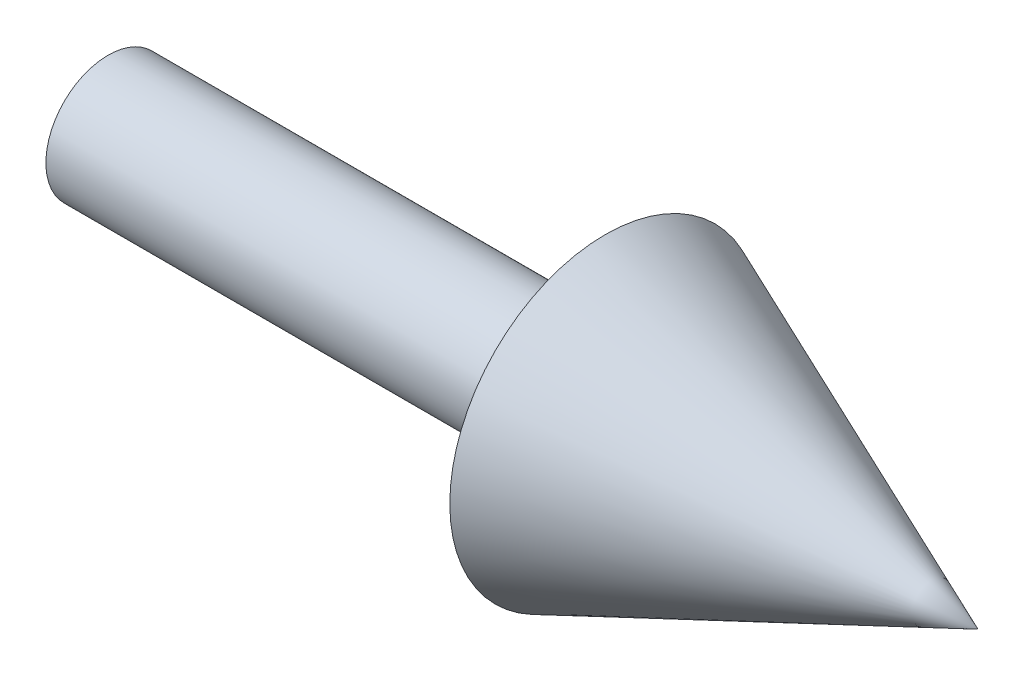
ISO-10303-21;
HEADER;
FILE_DESCRIPTION(('STEP AP214'),'2;1');
FILE_NAME('part.step','',(''),(''),'','','');
FILE_SCHEMA(('AUTOMOTIVE_DESIGN { 1 0 10303 214 1 1 1 1 }'));
ENDSEC;
DATA;
#1=APPLICATION_CONTEXT('core data for automotive mechanical design processes');
#2=APPLICATION_PROTOCOL_DEFINITION('international standard','automotive_design',2000,#1);
#3=PRODUCT_CONTEXT('',#1,'mechanical');
#4=PRODUCT('Part','Part','',(#3));
#5=PRODUCT_RELATED_PRODUCT_CATEGORY('part','',(#4));
#6=PRODUCT_DEFINITION_FORMATION('','',#4);
#7=PRODUCT_DEFINITION_CONTEXT('part definition',#1,'design');
#8=PRODUCT_DEFINITION('design','',#6,#7);
#9=PRODUCT_DEFINITION_SHAPE('','',#8);
#10=(LENGTH_UNIT() NAMED_UNIT(*) SI_UNIT(.MILLI.,.METRE.));
#11=(NAMED_UNIT(*) PLANE_ANGLE_UNIT() SI_UNIT($,.RADIAN.));
#12=(NAMED_UNIT(*) SI_UNIT($,.STERADIAN.) SOLID_ANGLE_UNIT());
#13=UNCERTAINTY_MEASURE_WITH_UNIT(LENGTH_MEASURE(1.E-05),#10,'distance_accuracy_value','');
#14=(GEOMETRIC_REPRESENTATION_CONTEXT(3) GLOBAL_UNCERTAINTY_ASSIGNED_CONTEXT((#13)) GLOBAL_UNIT_ASSIGNED_CONTEXT((#10,
#11,#12)) REPRESENTATION_CONTEXT('',''));
#15=CARTESIAN_POINT('',(0.,0.,0.));
#16=DIRECTION('',(0.,0.,1.));
#17=DIRECTION('',(1.,0.,0.));
#18=AXIS2_PLACEMENT_3D('',#15,#16,#17);
#19=CARTESIAN_POINT('',(0.,0.,0.));
#20=DIRECTION('',(-1.,0.,0.));
#21=DIRECTION('',(0.,0.,1.));
#22=AXIS2_PLACEMENT_3D('',#19,#20,#21);
#23=PLANE('',#22);
#24=CARTESIAN_POINT('',(0.,0.,0.));
#25=DIRECTION('',(1.,0.,0.));
#26=DIRECTION('',(0.,0.,-1.));
#27=AXIS2_PLACEMENT_3D('',#24,#25,#26);
#28=CIRCLE('',#27,5.);
#29=CARTESIAN_POINT('',(0.,0.,-5.));
#30=VERTEX_POINT('',#29);
#31=EDGE_CURVE('E11',#30,#30,#28,.T.);
#32=ORIENTED_EDGE('',*,*,#31,.F.);
#33=EDGE_LOOP('',(#32));
#34=FACE_BOUND('',#33,.T.);
#35=ADVANCED_FACE('F36',(#34),#23,.T.);
#36=CARTESIAN_POINT('',(0.,0.,0.));
#37=DIRECTION('',(1.,0.,0.));
#38=DIRECTION('',(0.,0.,-1.));
#39=AXIS2_PLACEMENT_3D('',#36,#37,#38);
#40=CYLINDRICAL_SURFACE('',#39,5.);
#41=ORIENTED_EDGE('',*,*,#31,.T.);
#42=EDGE_LOOP('',(#41));
#43=FACE_BOUND('',#42,.T.);
#44=CARTESIAN_POINT('',(40.,0.,0.));
#45=DIRECTION('',(1.,0.,0.));
#46=DIRECTION('',(0.,0.,-1.));
#47=AXIS2_PLACEMENT_3D('',#44,#45,#46);
#48=CIRCLE('',#47,5.);
#49=CARTESIAN_POINT('',(40.,0.,-5.));
#50=VERTEX_POINT('',#49);
#51=EDGE_CURVE('E42',#50,#50,#48,.T.);
#52=ORIENTED_EDGE('',*,*,#51,.F.);
#53=EDGE_LOOP('',(#52));
#54=FACE_BOUND('',#53,.T.);
#55=ADVANCED_FACE('F53',(#43,#54),#40,.T.);
#56=CARTESIAN_POINT('',(40.,5.,0.));
#57=DIRECTION('',(-1.,0.,0.));
#58=DIRECTION('',(0.,0.,1.));
#59=AXIS2_PLACEMENT_3D('',#56,#57,#58);
#60=PLANE('',#59);
#61=ORIENTED_EDGE('',*,*,#51,.T.);
#62=EDGE_LOOP('',(#61));
#63=FACE_BOUND('',#62,.T.);
#64=CARTESIAN_POINT('',(40.,0.,0.));
#65=DIRECTION('',(1.,0.,0.));
#66=DIRECTION('',(0.,0.,-1.));
#67=AXIS2_PLACEMENT_3D('',#64,#65,#66);
#68=CIRCLE('',#67,12.5);
#69=CARTESIAN_POINT('',(40.,0.,-12.5));
#70=VERTEX_POINT('',#69);
#71=EDGE_CURVE('E67',#70,#70,#68,.T.);
#72=ORIENTED_EDGE('',*,*,#71,.F.);
#73=EDGE_LOOP('',(#72));
#74=FACE_BOUND('',#73,.T.);
#75=ADVANCED_FACE('F47',(#63,#74),#60,.T.);
#76=CARTESIAN_POINT('',(70.,0.,0.));
#77=DIRECTION('',(-1.,0.,0.));
#78=DIRECTION('',(0.,0.,1.));
#79=AXIS2_PLACEMENT_3D('',#76,#77,#78);
#80=CONICAL_SURFACE('',#79,0.,0.394791119699762);
#81=ORIENTED_EDGE('',*,*,#71,.T.);
#82=EDGE_LOOP('',(#81));
#83=FACE_BOUND('',#82,.T.);
#84=CARTESIAN_POINT('',(70.,0.,0.));
#85=VERTEX_POINT('',#84);
#86=VERTEX_LOOP('',#85);
#87=FACE_BOUND('',#86,.T.);
#88=ADVANCED_FACE('F45',(#83,#87),#80,.T.);
#89=CLOSED_SHELL('',(#35,#55,#75,#88));
#90=MANIFOLD_SOLID_BREP('B2',#89);
#91=ADVANCED_BREP_SHAPE_REPRESENTATION('',(#18,#90),#14);
#92=SHAPE_DEFINITION_REPRESENTATION(#9,#91);
ENDSEC;
END-ISO-10303-21;
